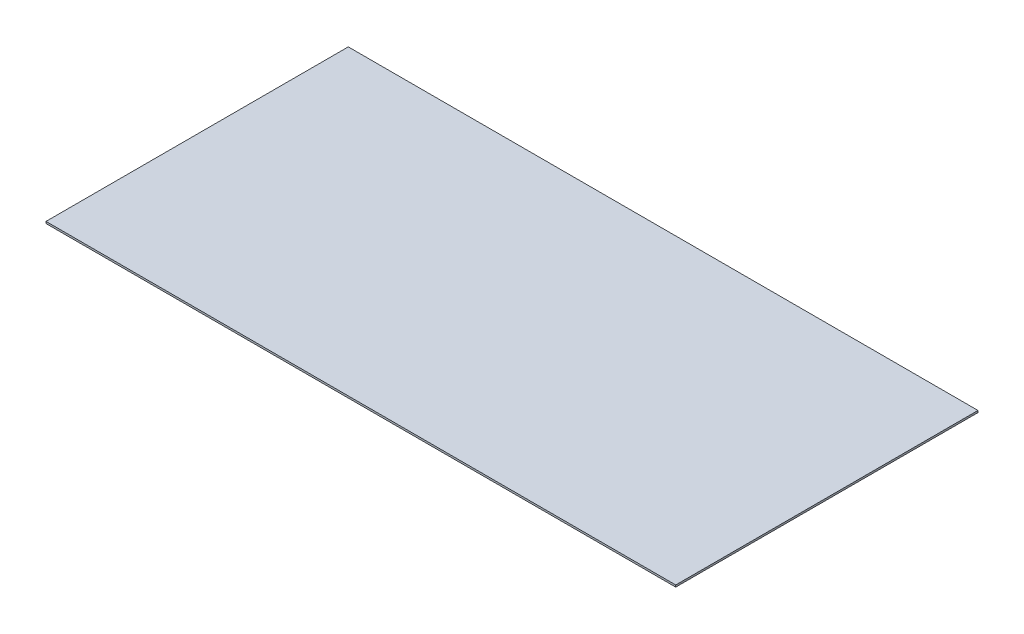
ISO-10303-21;
HEADER;
FILE_DESCRIPTION(('STEP AP214'),'2;1');
FILE_NAME('part.step','',(''),(''),'','','');
FILE_SCHEMA(('AUTOMOTIVE_DESIGN { 1 0 10303 214 1 1 1 1 }'));
ENDSEC;
DATA;
#1=APPLICATION_CONTEXT('core data for automotive mechanical design processes');
#2=APPLICATION_PROTOCOL_DEFINITION('international standard','automotive_design',2000,#1);
#3=PRODUCT_CONTEXT('',#1,'mechanical');
#4=PRODUCT('Part','Part','',(#3));
#5=PRODUCT_RELATED_PRODUCT_CATEGORY('part','',(#4));
#6=PRODUCT_DEFINITION_FORMATION('','',#4);
#7=PRODUCT_DEFINITION_CONTEXT('part definition',#1,'design');
#8=PRODUCT_DEFINITION('design','',#6,#7);
#9=PRODUCT_DEFINITION_SHAPE('','',#8);
#10=(LENGTH_UNIT() NAMED_UNIT(*) SI_UNIT(.MILLI.,.METRE.));
#11=(NAMED_UNIT(*) PLANE_ANGLE_UNIT() SI_UNIT($,.RADIAN.));
#12=(NAMED_UNIT(*) SI_UNIT($,.STERADIAN.) SOLID_ANGLE_UNIT());
#13=UNCERTAINTY_MEASURE_WITH_UNIT(LENGTH_MEASURE(1.E-05),#10,'distance_accuracy_value','');
#14=(GEOMETRIC_REPRESENTATION_CONTEXT(3) GLOBAL_UNCERTAINTY_ASSIGNED_CONTEXT((#13)) GLOBAL_UNIT_ASSIGNED_CONTEXT((#10,
#11,#12)) REPRESENTATION_CONTEXT('',''));
#15=CARTESIAN_POINT('',(0.,0.,0.));
#16=DIRECTION('',(0.,0.,1.));
#17=DIRECTION('',(1.,0.,0.));
#18=AXIS2_PLACEMENT_3D('',#15,#16,#17);
#19=CARTESIAN_POINT('',(25.,0.15,12.));
#20=DIRECTION('',(-1.,0.,0.));
#21=DIRECTION('',(0.,0.,1.));
#22=AXIS2_PLACEMENT_3D('',#19,#20,#21);
#23=PLANE('',#22);
#24=DIRECTION('',(0.,0.,-1.));
#25=VECTOR('',#24,1.);
#26=CARTESIAN_POINT('',(25.,0.,12.));
#27=LINE('',#26,#25);
#28=CARTESIAN_POINT('',(25.,0.,12.));
#29=VERTEX_POINT('',#28);
#30=CARTESIAN_POINT('',(25.,0.,-12.));
#31=VERTEX_POINT('',#30);
#32=EDGE_CURVE('E95',#29,#31,#27,.T.);
#33=ORIENTED_EDGE('',*,*,#32,.T.);
#34=DIRECTION('',(0.,-1.,0.));
#35=VECTOR('',#34,1.);
#36=CARTESIAN_POINT('',(25.,0.15,-12.));
#37=LINE('',#36,#35);
#38=CARTESIAN_POINT('',(25.,0.15,-12.));
#39=VERTEX_POINT('',#38);
#40=EDGE_CURVE('E11',#39,#31,#37,.T.);
#41=ORIENTED_EDGE('',*,*,#40,.F.);
#42=DIRECTION('',(0.,0.,-1.));
#43=VECTOR('',#42,1.);
#44=CARTESIAN_POINT('',(25.,0.15,12.));
#45=LINE('',#44,#43);
#46=CARTESIAN_POINT('',(25.,0.15,12.));
#47=VERTEX_POINT('',#46);
#48=EDGE_CURVE('E83',#47,#39,#45,.T.);
#49=ORIENTED_EDGE('',*,*,#48,.F.);
#50=DIRECTION('',(0.,-1.,0.));
#51=VECTOR('',#50,1.);
#52=CARTESIAN_POINT('',(25.,0.15,12.));
#53=LINE('',#52,#51);
#54=EDGE_CURVE('E91',#47,#29,#53,.T.);
#55=ORIENTED_EDGE('',*,*,#54,.T.);
#56=EDGE_LOOP('',(#33,#41,#49,#55));
#57=FACE_BOUND('',#56,.T.);
#58=ADVANCED_FACE('F32',(#57),#23,.F.);
#59=CARTESIAN_POINT('',(-25.,0.15,-12.));
#60=DIRECTION('',(0.,0.,1.));
#61=DIRECTION('',(1.,0.,0.));
#62=AXIS2_PLACEMENT_3D('',#59,#60,#61);
#63=PLANE('',#62);
#64=DIRECTION('',(-1.,0.,0.));
#65=VECTOR('',#64,1.);
#66=CARTESIAN_POINT('',(-25.,0.,-12.));
#67=LINE('',#66,#65);
#68=CARTESIAN_POINT('',(-25.,0.,-12.));
#69=VERTEX_POINT('',#68);
#70=EDGE_CURVE('E87',#31,#69,#67,.T.);
#71=ORIENTED_EDGE('',*,*,#70,.T.);
#72=DIRECTION('',(0.,-1.,0.));
#73=VECTOR('',#72,1.);
#74=CARTESIAN_POINT('',(-25.,0.15,-12.));
#75=LINE('',#74,#73);
#76=CARTESIAN_POINT('',(-25.,0.15,-12.));
#77=VERTEX_POINT('',#76);
#78=EDGE_CURVE('E40',#77,#69,#75,.T.);
#79=ORIENTED_EDGE('',*,*,#78,.F.);
#80=DIRECTION('',(-1.,0.,0.));
#81=VECTOR('',#80,1.);
#82=CARTESIAN_POINT('',(-25.,0.15,-12.));
#83=LINE('',#82,#81);
#84=EDGE_CURVE('E78',#39,#77,#83,.T.);
#85=ORIENTED_EDGE('',*,*,#84,.F.);
#86=ORIENTED_EDGE('',*,*,#40,.T.);
#87=EDGE_LOOP('',(#71,#79,#85,#86));
#88=FACE_BOUND('',#87,.T.);
#89=ADVANCED_FACE('F86',(#88),#63,.F.);
#90=CARTESIAN_POINT('',(-25.,0.15,12.));
#91=DIRECTION('',(1.,0.,0.));
#92=DIRECTION('',(0.,0.,-1.));
#93=AXIS2_PLACEMENT_3D('',#90,#91,#92);
#94=PLANE('',#93);
#95=DIRECTION('',(0.,0.,1.));
#96=VECTOR('',#95,1.);
#97=CARTESIAN_POINT('',(-25.,0.,12.));
#98=LINE('',#97,#96);
#99=CARTESIAN_POINT('',(-25.,0.,12.));
#100=VERTEX_POINT('',#99);
#101=EDGE_CURVE('E65',#69,#100,#98,.T.);
#102=ORIENTED_EDGE('',*,*,#101,.T.);
#103=DIRECTION('',(0.,-1.,0.));
#104=VECTOR('',#103,1.);
#105=CARTESIAN_POINT('',(-25.,0.15,12.));
#106=LINE('',#105,#104);
#107=CARTESIAN_POINT('',(-25.,0.15,12.));
#108=VERTEX_POINT('',#107);
#109=EDGE_CURVE('E88',#108,#100,#106,.T.);
#110=ORIENTED_EDGE('',*,*,#109,.F.);
#111=DIRECTION('',(0.,0.,1.));
#112=VECTOR('',#111,1.);
#113=CARTESIAN_POINT('',(-25.,0.15,12.));
#114=LINE('',#113,#112);
#115=EDGE_CURVE('E81',#77,#108,#114,.T.);
#116=ORIENTED_EDGE('',*,*,#115,.F.);
#117=ORIENTED_EDGE('',*,*,#78,.T.);
#118=EDGE_LOOP('',(#102,#110,#116,#117));
#119=FACE_BOUND('',#118,.T.);
#120=ADVANCED_FACE('F89',(#119),#94,.F.);
#121=CARTESIAN_POINT('',(-25.,0.15,12.));
#122=DIRECTION('',(0.,0.,-1.));
#123=DIRECTION('',(-1.,0.,0.));
#124=AXIS2_PLACEMENT_3D('',#121,#122,#123);
#125=PLANE('',#124);
#126=DIRECTION('',(1.,0.,0.));
#127=VECTOR('',#126,1.);
#128=CARTESIAN_POINT('',(-25.,0.,12.));
#129=LINE('',#128,#127);
#130=EDGE_CURVE('E71',#100,#29,#129,.T.);
#131=ORIENTED_EDGE('',*,*,#130,.T.);
#132=ORIENTED_EDGE('',*,*,#54,.F.);
#133=DIRECTION('',(1.,0.,0.));
#134=VECTOR('',#133,1.);
#135=CARTESIAN_POINT('',(-25.,0.15,12.));
#136=LINE('',#135,#134);
#137=EDGE_CURVE('E48',#108,#47,#136,.T.);
#138=ORIENTED_EDGE('',*,*,#137,.F.);
#139=ORIENTED_EDGE('',*,*,#109,.T.);
#140=EDGE_LOOP('',(#131,#132,#138,#139));
#141=FACE_BOUND('',#140,.T.);
#142=ADVANCED_FACE('F102',(#141),#125,.F.);
#143=CARTESIAN_POINT('',(0.,0.15,0.));
#144=DIRECTION('',(0.,-1.,0.));
#145=DIRECTION('',(0.,0.,-1.));
#146=AXIS2_PLACEMENT_3D('',#143,#144,#145);
#147=PLANE('',#146);
#148=ORIENTED_EDGE('',*,*,#48,.T.);
#149=ORIENTED_EDGE('',*,*,#84,.T.);
#150=ORIENTED_EDGE('',*,*,#115,.T.);
#151=ORIENTED_EDGE('',*,*,#137,.T.);
#152=EDGE_LOOP('',(#148,#149,#150,#151));
#153=FACE_BOUND('',#152,.T.);
#154=ADVANCED_FACE('F79',(#153),#147,.F.);
#155=CARTESIAN_POINT('',(0.,0.,0.));
#156=DIRECTION('',(0.,-1.,0.));
#157=DIRECTION('',(0.,0.,-1.));
#158=AXIS2_PLACEMENT_3D('',#155,#156,#157);
#159=PLANE('',#158);
#160=ORIENTED_EDGE('',*,*,#32,.F.);
#161=ORIENTED_EDGE('',*,*,#130,.F.);
#162=ORIENTED_EDGE('',*,*,#101,.F.);
#163=ORIENTED_EDGE('',*,*,#70,.F.);
#164=EDGE_LOOP('',(#160,#161,#162,#163));
#165=FACE_BOUND('',#164,.T.);
#166=ADVANCED_FACE('F105',(#165),#159,.T.);
#167=CLOSED_SHELL('',(#58,#89,#120,#142,#154,#166));
#168=MANIFOLD_SOLID_BREP('B2',#167);
#169=ADVANCED_BREP_SHAPE_REPRESENTATION('',(#18,#168),#14);
#170=SHAPE_DEFINITION_REPRESENTATION(#9,#169);
ENDSEC;
END-ISO-10303-21;
